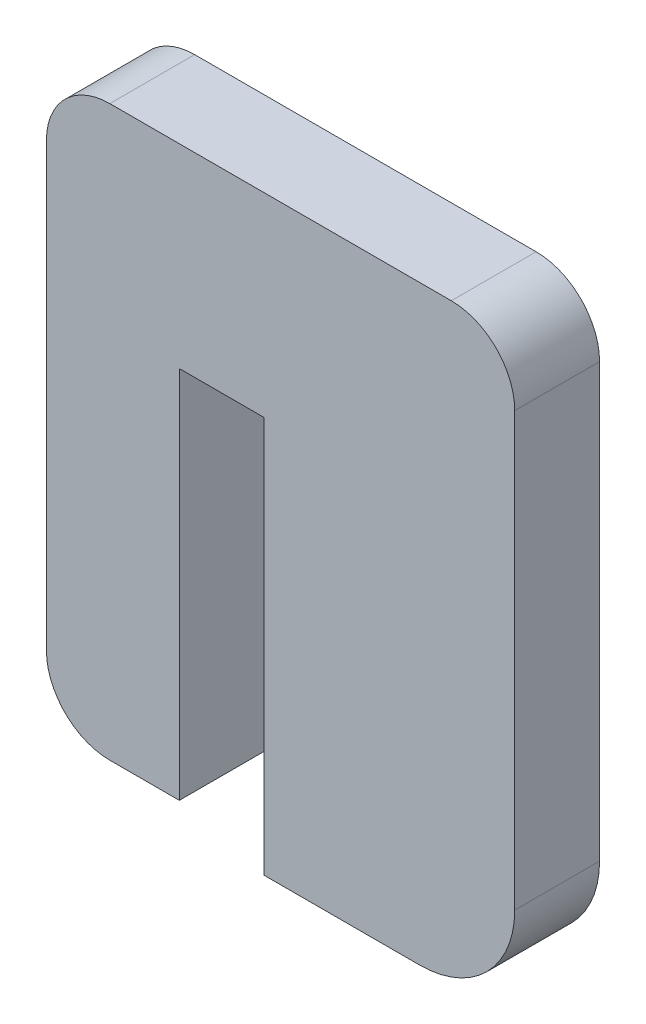
ISO-10303-21;
HEADER;
FILE_DESCRIPTION(('STEP AP214'),'2;1');
FILE_NAME('part.step','',(''),(''),'','','');
FILE_SCHEMA(('AUTOMOTIVE_DESIGN { 1 0 10303 214 1 1 1 1 }'));
ENDSEC;
DATA;
#1=APPLICATION_CONTEXT('core data for automotive mechanical design processes');
#2=APPLICATION_PROTOCOL_DEFINITION('international standard','automotive_design',2000,#1);
#3=PRODUCT_CONTEXT('',#1,'mechanical');
#4=PRODUCT('Part','Part','',(#3));
#5=PRODUCT_RELATED_PRODUCT_CATEGORY('part','',(#4));
#6=PRODUCT_DEFINITION_FORMATION('','',#4);
#7=PRODUCT_DEFINITION_CONTEXT('part definition',#1,'design');
#8=PRODUCT_DEFINITION('design','',#6,#7);
#9=PRODUCT_DEFINITION_SHAPE('','',#8);
#10=(LENGTH_UNIT() NAMED_UNIT(*) SI_UNIT(.MILLI.,.METRE.));
#11=(NAMED_UNIT(*) PLANE_ANGLE_UNIT() SI_UNIT($,.RADIAN.));
#12=(NAMED_UNIT(*) SI_UNIT($,.STERADIAN.) SOLID_ANGLE_UNIT());
#13=UNCERTAINTY_MEASURE_WITH_UNIT(LENGTH_MEASURE(1.E-05),#10,'distance_accuracy_value','');
#14=(GEOMETRIC_REPRESENTATION_CONTEXT(3) GLOBAL_UNCERTAINTY_ASSIGNED_CONTEXT((#13)) GLOBAL_UNIT_ASSIGNED_CONTEXT((#10,
#11,#12)) REPRESENTATION_CONTEXT('',''));
#15=CARTESIAN_POINT('',(0.,0.,0.));
#16=DIRECTION('',(0.,0.,1.));
#17=DIRECTION('',(1.,0.,0.));
#18=AXIS2_PLACEMENT_3D('',#15,#16,#17);
#19=CARTESIAN_POINT('',(4.,5.4181546867,5.35));
#20=DIRECTION('',(0.,0.,-1.));
#21=DIRECTION('',(-1.,0.,0.));
#22=AXIS2_PLACEMENT_3D('',#19,#20,#21);
#23=CYLINDRICAL_SURFACE('',#22,4.);
#24=CARTESIAN_POINT('',(4.,5.4181546867,0.));
#25=DIRECTION('',(0.,0.,1.));
#26=DIRECTION('',(1.,0.,0.));
#27=AXIS2_PLACEMENT_3D('',#24,#25,#26);
#28=CIRCLE('',#27,4.);
#29=CARTESIAN_POINT('',(0.,5.4181548767,0.));
#30=VERTEX_POINT('',#29);
#31=CARTESIAN_POINT('',(4.,1.4181546867,0.));
#32=VERTEX_POINT('',#31);
#33=EDGE_CURVE('E153',#30,#32,#28,.T.);
#34=ORIENTED_EDGE('',*,*,#33,.T.);
#35=DIRECTION('',(0.,0.,-1.));
#36=VECTOR('',#35,1.);
#37=CARTESIAN_POINT('',(4.,1.4181546867,5.35));
#38=LINE('',#37,#36);
#39=CARTESIAN_POINT('',(4.,1.4181546867,5.35));
#40=VERTEX_POINT('',#39);
#41=EDGE_CURVE('E11',#40,#32,#38,.T.);
#42=ORIENTED_EDGE('',*,*,#41,.F.);
#43=CARTESIAN_POINT('',(4.,5.4181546867,5.35));
#44=DIRECTION('',(0.,0.,1.));
#45=DIRECTION('',(1.,0.,0.));
#46=AXIS2_PLACEMENT_3D('',#43,#44,#45);
#47=CIRCLE('',#46,4.);
#48=CARTESIAN_POINT('',(0.,5.4181548767,5.35));
#49=VERTEX_POINT('',#48);
#50=EDGE_CURVE('E175',#49,#40,#47,.T.);
#51=ORIENTED_EDGE('',*,*,#50,.F.);
#52=DIRECTION('',(0.,0.,-1.));
#53=VECTOR('',#52,1.);
#54=CARTESIAN_POINT('',(0.,5.4181548767,5.35));
#55=LINE('',#54,#53);
#56=EDGE_CURVE('E149',#49,#30,#55,.T.);
#57=ORIENTED_EDGE('',*,*,#56,.T.);
#58=EDGE_LOOP('',(#34,#42,#51,#57));
#59=FACE_BOUND('',#58,.T.);
#60=ADVANCED_FACE('F33',(#59),#23,.T.);
#61=CARTESIAN_POINT('',(8.38032457980001,1.4181546867,5.35));
#62=DIRECTION('',(0.,1.,0.));
#63=DIRECTION('',(0.,0.,1.));
#64=AXIS2_PLACEMENT_3D('',#61,#62,#63);
#65=PLANE('',#64);
#66=DIRECTION('',(1.,0.,0.));
#67=VECTOR('',#66,1.);
#68=CARTESIAN_POINT('',(8.38032457980001,1.4181546867,0.));
#69=LINE('',#68,#67);
#70=CARTESIAN_POINT('',(8.38032457980001,1.4181546867,0.));
#71=VERTEX_POINT('',#70);
#72=EDGE_CURVE('E156',#32,#71,#69,.T.);
#73=ORIENTED_EDGE('',*,*,#72,.T.);
#74=DIRECTION('',(0.,0.,-1.));
#75=VECTOR('',#74,1.);
#76=CARTESIAN_POINT('',(8.38032457980001,1.4181546867,5.35));
#77=LINE('',#76,#75);
#78=CARTESIAN_POINT('',(8.38032457980001,1.4181546867,5.35));
#79=VERTEX_POINT('',#78);
#80=EDGE_CURVE('E41',#79,#71,#77,.T.);
#81=ORIENTED_EDGE('',*,*,#80,.F.);
#82=DIRECTION('',(1.,0.,0.));
#83=VECTOR('',#82,1.);
#84=CARTESIAN_POINT('',(8.38032457980001,1.4181546867,5.35));
#85=LINE('',#84,#83);
#86=EDGE_CURVE('E104',#40,#79,#85,.T.);
#87=ORIENTED_EDGE('',*,*,#86,.F.);
#88=ORIENTED_EDGE('',*,*,#41,.T.);
#89=EDGE_LOOP('',(#73,#81,#87,#88));
#90=FACE_BOUND('',#89,.T.);
#91=ADVANCED_FACE('F253',(#90),#65,.F.);
#92=CARTESIAN_POINT('',(8.38032457980001,25.0000003725,5.35));
#93=DIRECTION('',(-1.,0.,0.));
#94=DIRECTION('',(0.,0.,1.));
#95=AXIS2_PLACEMENT_3D('',#92,#93,#94);
#96=PLANE('',#95);
#97=DIRECTION('',(0.,1.,0.));
#98=VECTOR('',#97,1.);
#99=CARTESIAN_POINT('',(8.38032457980001,25.0000003725,0.));
#100=LINE('',#99,#98);
#101=CARTESIAN_POINT('',(8.38032457980001,25.0000003725,0.));
#102=VERTEX_POINT('',#101);
#103=EDGE_CURVE('E158',#71,#102,#100,.T.);
#104=ORIENTED_EDGE('',*,*,#103,.T.);
#105=DIRECTION('',(0.,0.,-1.));
#106=VECTOR('',#105,1.);
#107=CARTESIAN_POINT('',(8.38032457980001,25.0000003725,5.35));
#108=LINE('',#107,#106);
#109=CARTESIAN_POINT('',(8.38032457980001,25.0000003725,5.35));
#110=VERTEX_POINT('',#109);
#111=EDGE_CURVE('E194',#110,#102,#108,.T.);
#112=ORIENTED_EDGE('',*,*,#111,.F.);
#113=DIRECTION('',(0.,1.,0.));
#114=VECTOR('',#113,1.);
#115=CARTESIAN_POINT('',(8.38032457980001,25.0000003725,5.35));
#116=LINE('',#115,#114);
#117=EDGE_CURVE('E202',#79,#110,#116,.T.);
#118=ORIENTED_EDGE('',*,*,#117,.F.);
#119=ORIENTED_EDGE('',*,*,#80,.T.);
#120=EDGE_LOOP('',(#104,#112,#118,#119));
#121=FACE_BOUND('',#120,.T.);
#122=ADVANCED_FACE('F200',(#121),#96,.F.);
#123=CARTESIAN_POINT('',(13.7303248048012,25.0000003725,5.35));
#124=DIRECTION('',(0.,1.,0.));
#125=DIRECTION('',(0.,0.,1.));
#126=AXIS2_PLACEMENT_3D('',#123,#124,#125);
#127=PLANE('',#126);
#128=DIRECTION('',(1.,0.,0.));
#129=VECTOR('',#128,1.);
#130=CARTESIAN_POINT('',(13.7303248048012,25.0000003725,0.));
#131=LINE('',#130,#129);
#132=CARTESIAN_POINT('',(13.7303248048012,25.0000003725,0.));
#133=VERTEX_POINT('',#132);
#134=EDGE_CURVE('E160',#102,#133,#131,.T.);
#135=ORIENTED_EDGE('',*,*,#134,.T.);
#136=DIRECTION('',(0.,0.,-1.));
#137=VECTOR('',#136,1.);
#138=CARTESIAN_POINT('',(13.7303248048012,25.0000003725,5.35));
#139=LINE('',#138,#137);
#140=CARTESIAN_POINT('',(13.7303248048012,25.0000003725,5.35));
#141=VERTEX_POINT('',#140);
#142=EDGE_CURVE('E191',#141,#133,#139,.T.);
#143=ORIENTED_EDGE('',*,*,#142,.F.);
#144=DIRECTION('',(1.,0.,0.));
#145=VECTOR('',#144,1.);
#146=CARTESIAN_POINT('',(13.7303248048012,25.0000003725,5.35));
#147=LINE('',#146,#145);
#148=EDGE_CURVE('E220',#110,#141,#147,.T.);
#149=ORIENTED_EDGE('',*,*,#148,.F.);
#150=ORIENTED_EDGE('',*,*,#111,.T.);
#151=EDGE_LOOP('',(#135,#143,#149,#150));
#152=FACE_BOUND('',#151,.T.);
#153=ADVANCED_FACE('F211',(#152),#127,.F.);
#154=CARTESIAN_POINT('',(13.7303248048012,-1.80411234884143E-13,5.35));
#155=DIRECTION('',(1.,0.,0.));
#156=DIRECTION('',(0.,0.,-1.));
#157=AXIS2_PLACEMENT_3D('',#154,#155,#156);
#158=PLANE('',#157);
#159=DIRECTION('',(0.,-1.,0.));
#160=VECTOR('',#159,1.);
#161=CARTESIAN_POINT('',(13.7303248048012,-1.80411234884143E-13,0.));
#162=LINE('',#161,#160);
#163=CARTESIAN_POINT('',(13.7303248048012,-1.80411234884143E-13,0.));
#164=VERTEX_POINT('',#163);
#165=EDGE_CURVE('E162',#133,#164,#162,.T.);
#166=ORIENTED_EDGE('',*,*,#165,.T.);
#167=DIRECTION('',(0.,0.,-1.));
#168=VECTOR('',#167,1.);
#169=CARTESIAN_POINT('',(13.7303248048012,-1.80411234884143E-13,5.35));
#170=LINE('',#169,#168);
#171=CARTESIAN_POINT('',(13.7303248048012,-1.80411234884143E-13,5.35));
#172=VERTEX_POINT('',#171);
#173=EDGE_CURVE('E188',#172,#164,#170,.T.);
#174=ORIENTED_EDGE('',*,*,#173,.F.);
#175=DIRECTION('',(0.,-1.,0.));
#176=VECTOR('',#175,1.);
#177=CARTESIAN_POINT('',(13.7303248048012,-1.80411234884143E-13,5.35));
#178=LINE('',#177,#176);
#179=EDGE_CURVE('E217',#141,#172,#178,.T.);
#180=ORIENTED_EDGE('',*,*,#179,.F.);
#181=ORIENTED_EDGE('',*,*,#142,.T.);
#182=EDGE_LOOP('',(#166,#174,#180,#181));
#183=FACE_BOUND('',#182,.T.);
#184=ADVANCED_FACE('F215',(#183),#158,.F.);
#185=CARTESIAN_POINT('',(23.5303249210012,-1.80411234884143E-13,5.35));
#186=DIRECTION('',(0.,1.,0.));
#187=DIRECTION('',(0.,0.,1.));
#188=AXIS2_PLACEMENT_3D('',#185,#186,#187);
#189=PLANE('',#188);
#190=DIRECTION('',(1.,0.,0.));
#191=VECTOR('',#190,1.);
#192=CARTESIAN_POINT('',(23.5303249210012,-1.80411234884143E-13,0.));
#193=LINE('',#192,#191);
#194=CARTESIAN_POINT('',(23.5303249210012,-1.80411241501588E-13,0.));
#195=VERTEX_POINT('',#194);
#196=EDGE_CURVE('E164',#164,#195,#193,.T.);
#197=ORIENTED_EDGE('',*,*,#196,.T.);
#198=DIRECTION('',(0.,0.,-1.));
#199=VECTOR('',#198,1.);
#200=CARTESIAN_POINT('',(23.5303249210012,-1.80411241501588E-13,5.35));
#201=LINE('',#200,#199);
#202=CARTESIAN_POINT('',(23.5303249210012,-1.80411241501588E-13,5.35));
#203=VERTEX_POINT('',#202);
#204=EDGE_CURVE('E185',#203,#195,#201,.T.);
#205=ORIENTED_EDGE('',*,*,#204,.F.);
#206=DIRECTION('',(1.,0.,0.));
#207=VECTOR('',#206,1.);
#208=CARTESIAN_POINT('',(23.5303249210012,-1.80411234884143E-13,5.35));
#209=LINE('',#208,#207);
#210=EDGE_CURVE('E219',#172,#203,#209,.T.);
#211=ORIENTED_EDGE('',*,*,#210,.F.);
#212=ORIENTED_EDGE('',*,*,#173,.T.);
#213=EDGE_LOOP('',(#197,#205,#211,#212));
#214=FACE_BOUND('',#213,.T.);
#215=ADVANCED_FACE('F266',(#214),#189,.F.);
#216=CARTESIAN_POINT('',(23.5303240419012,5.99999999999975,5.35));
#217=DIRECTION('',(0.,0.,-1.));
#218=DIRECTION('',(-1.,0.,0.));
#219=AXIS2_PLACEMENT_3D('',#216,#217,#218);
#220=CYLINDRICAL_SURFACE('',#219,6.);
#221=CARTESIAN_POINT('',(23.5303240419012,5.99999999999975,0.));
#222=DIRECTION('',(0.,0.,1.));
#223=DIRECTION('',(1.,0.,0.));
#224=AXIS2_PLACEMENT_3D('',#221,#222,#223);
#225=CIRCLE('',#224,6.);
#226=CARTESIAN_POINT('',(29.5303240419012,5.99999999999975,0.));
#227=VERTEX_POINT('',#226);
#228=EDGE_CURVE('E166',#195,#227,#225,.T.);
#229=ORIENTED_EDGE('',*,*,#228,.T.);
#230=DIRECTION('',(0.,0.,-1.));
#231=VECTOR('',#230,1.);
#232=CARTESIAN_POINT('',(29.5303240419012,5.99999999999975,5.35));
#233=LINE('',#232,#231);
#234=CARTESIAN_POINT('',(29.5303240419012,5.99999999999975,5.35));
#235=VERTEX_POINT('',#234);
#236=EDGE_CURVE('E182',#235,#227,#233,.T.);
#237=ORIENTED_EDGE('',*,*,#236,.F.);
#238=CARTESIAN_POINT('',(23.5303240419012,5.99999999999975,5.35));
#239=DIRECTION('',(0.,0.,1.));
#240=DIRECTION('',(1.,0.,0.));
#241=AXIS2_PLACEMENT_3D('',#238,#239,#240);
#242=CIRCLE('',#241,6.);
#243=EDGE_CURVE('E222',#203,#235,#242,.T.);
#244=ORIENTED_EDGE('',*,*,#243,.F.);
#245=ORIENTED_EDGE('',*,*,#204,.T.);
#246=EDGE_LOOP('',(#229,#237,#244,#245));
#247=FACE_BOUND('',#246,.T.);
#248=ADVANCED_FACE('F269',(#247),#220,.T.);
#249=CARTESIAN_POINT('',(29.5303240419012,33.2781523465998,5.35));
#250=DIRECTION('',(-1.,0.,0.));
#251=DIRECTION('',(0.,0.,1.));
#252=AXIS2_PLACEMENT_3D('',#249,#250,#251);
#253=PLANE('',#252);
#254=DIRECTION('',(0.,1.,0.));
#255=VECTOR('',#254,1.);
#256=CARTESIAN_POINT('',(29.5303240419012,33.2781523465998,0.));
#257=LINE('',#256,#255);
#258=CARTESIAN_POINT('',(29.5303240419012,33.2781523465998,0.));
#259=VERTEX_POINT('',#258);
#260=EDGE_CURVE('E168',#227,#259,#257,.T.);
#261=ORIENTED_EDGE('',*,*,#260,.T.);
#262=DIRECTION('',(0.,0.,-1.));
#263=VECTOR('',#262,1.);
#264=CARTESIAN_POINT('',(29.5303240419012,33.2781523465998,5.35));
#265=LINE('',#264,#263);
#266=CARTESIAN_POINT('',(29.5303240419012,33.2781523465998,5.35));
#267=VERTEX_POINT('',#266);
#268=EDGE_CURVE('E179',#267,#259,#265,.T.);
#269=ORIENTED_EDGE('',*,*,#268,.F.);
#270=DIRECTION('',(0.,1.,0.));
#271=VECTOR('',#270,1.);
#272=CARTESIAN_POINT('',(29.5303240419012,33.2781523465998,5.35));
#273=LINE('',#272,#271);
#274=EDGE_CURVE('E228',#235,#267,#273,.T.);
#275=ORIENTED_EDGE('',*,*,#274,.F.);
#276=ORIENTED_EDGE('',*,*,#236,.T.);
#277=EDGE_LOOP('',(#261,#269,#275,#276));
#278=FACE_BOUND('',#277,.T.);
#279=ADVANCED_FACE('F234',(#278),#253,.F.);
#280=CARTESIAN_POINT('',(25.5303240419024,33.278149277,5.35));
#281=DIRECTION('',(0.,0.,-1.));
#282=DIRECTION('',(-1.,0.,0.));
#283=AXIS2_PLACEMENT_3D('',#280,#281,#282);
#284=CYLINDRICAL_SURFACE('',#283,4.00000000000001);
#285=CARTESIAN_POINT('',(25.5303240419024,33.278149277,0.));
#286=DIRECTION('',(0.,0.,1.));
#287=DIRECTION('',(1.,0.,0.));
#288=AXIS2_PLACEMENT_3D('',#285,#286,#287);
#289=CIRCLE('',#288,4.00000000000001);
#290=CARTESIAN_POINT('',(25.5303240419024,37.278149277,0.));
#291=VERTEX_POINT('',#290);
#292=EDGE_CURVE('E170',#259,#291,#289,.T.);
#293=ORIENTED_EDGE('',*,*,#292,.T.);
#294=DIRECTION('',(0.,0.,-1.));
#295=VECTOR('',#294,1.);
#296=CARTESIAN_POINT('',(25.5303240419024,37.278149277,5.35));
#297=LINE('',#296,#295);
#298=CARTESIAN_POINT('',(25.5303240419024,37.278149277,5.35));
#299=VERTEX_POINT('',#298);
#300=EDGE_CURVE('E144',#299,#291,#297,.T.);
#301=ORIENTED_EDGE('',*,*,#300,.F.);
#302=CARTESIAN_POINT('',(25.5303240419024,33.278149277,5.35));
#303=DIRECTION('',(0.,0.,1.));
#304=DIRECTION('',(1.,0.,0.));
#305=AXIS2_PLACEMENT_3D('',#302,#303,#304);
#306=CIRCLE('',#305,4.00000000000001);
#307=EDGE_CURVE('E135',#267,#299,#306,.T.);
#308=ORIENTED_EDGE('',*,*,#307,.F.);
#309=ORIENTED_EDGE('',*,*,#268,.T.);
#310=EDGE_LOOP('',(#293,#301,#308,#309));
#311=FACE_BOUND('',#310,.T.);
#312=ADVANCED_FACE('F238',(#311),#284,.T.);
#313=CARTESIAN_POINT('',(3.99999972440119,37.278149277,5.35));
#314=DIRECTION('',(0.,-1.,0.));
#315=DIRECTION('',(0.,0.,-1.));
#316=AXIS2_PLACEMENT_3D('',#313,#314,#315);
#317=PLANE('',#316);
#318=DIRECTION('',(-1.,0.,0.));
#319=VECTOR('',#318,1.);
#320=CARTESIAN_POINT('',(3.99999972440119,37.278149277,0.));
#321=LINE('',#320,#319);
#322=CARTESIAN_POINT('',(3.99999972440119,37.278149277,0.));
#323=VERTEX_POINT('',#322);
#324=EDGE_CURVE('E143',#291,#323,#321,.T.);
#325=ORIENTED_EDGE('',*,*,#324,.T.);
#326=DIRECTION('',(0.,0.,-1.));
#327=VECTOR('',#326,1.);
#328=CARTESIAN_POINT('',(3.99999972440119,37.278149277,5.35));
#329=LINE('',#328,#327);
#330=CARTESIAN_POINT('',(3.99999972440119,37.278149277,5.35));
#331=VERTEX_POINT('',#330);
#332=EDGE_CURVE('E140',#331,#323,#329,.T.);
#333=ORIENTED_EDGE('',*,*,#332,.F.);
#334=DIRECTION('',(-1.,0.,0.));
#335=VECTOR('',#334,1.);
#336=CARTESIAN_POINT('',(3.99999972440119,37.278149277,5.35));
#337=LINE('',#336,#335);
#338=EDGE_CURVE('E129',#299,#331,#337,.T.);
#339=ORIENTED_EDGE('',*,*,#338,.F.);
#340=ORIENTED_EDGE('',*,*,#300,.T.);
#341=EDGE_LOOP('',(#325,#333,#339,#340));
#342=FACE_BOUND('',#341,.T.);
#343=ADVANCED_FACE('F141',(#342),#317,.F.);
#344=CARTESIAN_POINT('',(4.00000000000002,33.278149277,5.35));
#345=DIRECTION('',(0.,0.,-1.));
#346=DIRECTION('',(-1.,0.,0.));
#347=AXIS2_PLACEMENT_3D('',#344,#345,#346);
#348=CYLINDRICAL_SURFACE('',#347,4.00000000000001);
#349=CARTESIAN_POINT('',(4.00000000000002,33.278149277,0.));
#350=DIRECTION('',(0.,0.,1.));
#351=DIRECTION('',(1.,0.,0.));
#352=AXIS2_PLACEMENT_3D('',#349,#350,#351);
#353=CIRCLE('',#352,4.00000000000001);
#354=CARTESIAN_POINT('',(0.,33.278149277,0.));
#355=VERTEX_POINT('',#354);
#356=EDGE_CURVE('E90',#323,#355,#353,.T.);
#357=ORIENTED_EDGE('',*,*,#356,.T.);
#358=DIRECTION('',(0.,0.,-1.));
#359=VECTOR('',#358,1.);
#360=CARTESIAN_POINT('',(0.,33.278149277,5.35));
#361=LINE('',#360,#359);
#362=CARTESIAN_POINT('',(0.,33.278149277,5.35));
#363=VERTEX_POINT('',#362);
#364=EDGE_CURVE('E145',#363,#355,#361,.T.);
#365=ORIENTED_EDGE('',*,*,#364,.F.);
#366=CARTESIAN_POINT('',(4.00000000000002,33.278149277,5.35));
#367=DIRECTION('',(0.,0.,1.));
#368=DIRECTION('',(1.,0.,0.));
#369=AXIS2_PLACEMENT_3D('',#366,#367,#368);
#370=CIRCLE('',#369,4.00000000000001);
#371=EDGE_CURVE('E133',#331,#363,#370,.T.);
#372=ORIENTED_EDGE('',*,*,#371,.F.);
#373=ORIENTED_EDGE('',*,*,#332,.T.);
#374=EDGE_LOOP('',(#357,#365,#372,#373));
#375=FACE_BOUND('',#374,.T.);
#376=ADVANCED_FACE('F147',(#375),#348,.T.);
#377=CARTESIAN_POINT('',(0.,5.4181548767,5.35));
#378=DIRECTION('',(1.,0.,0.));
#379=DIRECTION('',(0.,0.,-1.));
#380=AXIS2_PLACEMENT_3D('',#377,#378,#379);
#381=PLANE('',#380);
#382=DIRECTION('',(0.,-1.,0.));
#383=VECTOR('',#382,1.);
#384=CARTESIAN_POINT('',(0.,5.4181548767,0.));
#385=LINE('',#384,#383);
#386=EDGE_CURVE('E96',#355,#30,#385,.T.);
#387=ORIENTED_EDGE('',*,*,#386,.T.);
#388=ORIENTED_EDGE('',*,*,#56,.F.);
#389=DIRECTION('',(0.,-1.,0.));
#390=VECTOR('',#389,1.);
#391=CARTESIAN_POINT('',(0.,5.4181548767,5.35));
#392=LINE('',#391,#390);
#393=EDGE_CURVE('E49',#363,#49,#392,.T.);
#394=ORIENTED_EDGE('',*,*,#393,.F.);
#395=ORIENTED_EDGE('',*,*,#364,.T.);
#396=EDGE_LOOP('',(#387,#388,#394,#395));
#397=FACE_BOUND('',#396,.T.);
#398=ADVANCED_FACE('F242',(#397),#381,.F.);
#399=CARTESIAN_POINT('',(4.,5.4181546867,5.35));
#400=DIRECTION('',(0.,0.,1.));
#401=DIRECTION('',(1.,0.,0.));
#402=AXIS2_PLACEMENT_3D('',#399,#400,#401);
#403=PLANE('',#402);
#404=ORIENTED_EDGE('',*,*,#50,.T.);
#405=ORIENTED_EDGE('',*,*,#86,.T.);
#406=ORIENTED_EDGE('',*,*,#117,.T.);
#407=ORIENTED_EDGE('',*,*,#148,.T.);
#408=ORIENTED_EDGE('',*,*,#179,.T.);
#409=ORIENTED_EDGE('',*,*,#210,.T.);
#410=ORIENTED_EDGE('',*,*,#243,.T.);
#411=ORIENTED_EDGE('',*,*,#274,.T.);
#412=ORIENTED_EDGE('',*,*,#307,.T.);
#413=ORIENTED_EDGE('',*,*,#338,.T.);
#414=ORIENTED_EDGE('',*,*,#371,.T.);
#415=ORIENTED_EDGE('',*,*,#393,.T.);
#416=EDGE_LOOP('',(#404,#405,#406,#407,#408,#409,#410,#411,#412,#413,#414,#415));
#417=FACE_BOUND('',#416,.T.);
#418=ADVANCED_FACE('F131',(#417),#403,.T.);
#419=CARTESIAN_POINT('',(4.,5.4181546867,0.));
#420=DIRECTION('',(0.,0.,1.));
#421=DIRECTION('',(1.,0.,0.));
#422=AXIS2_PLACEMENT_3D('',#419,#420,#421);
#423=PLANE('',#422);
#424=ORIENTED_EDGE('',*,*,#33,.F.);
#425=ORIENTED_EDGE('',*,*,#386,.F.);
#426=ORIENTED_EDGE('',*,*,#356,.F.);
#427=ORIENTED_EDGE('',*,*,#324,.F.);
#428=ORIENTED_EDGE('',*,*,#292,.F.);
#429=ORIENTED_EDGE('',*,*,#260,.F.);
#430=ORIENTED_EDGE('',*,*,#228,.F.);
#431=ORIENTED_EDGE('',*,*,#196,.F.);
#432=ORIENTED_EDGE('',*,*,#165,.F.);
#433=ORIENTED_EDGE('',*,*,#134,.F.);
#434=ORIENTED_EDGE('',*,*,#103,.F.);
#435=ORIENTED_EDGE('',*,*,#72,.F.);
#436=EDGE_LOOP('',(#424,#425,#426,#427,#428,#429,#430,#431,#432,#433,#434,#435));
#437=FACE_BOUND('',#436,.T.);
#438=ADVANCED_FACE('F206',(#437),#423,.F.);
#439=CLOSED_SHELL('',(#60,#91,#122,#153,#184,#215,#248,#279,#312,#343,#376,#398,#418,#438));
#440=MANIFOLD_SOLID_BREP('B2',#439);
#441=ADVANCED_BREP_SHAPE_REPRESENTATION('',(#18,#440),#14);
#442=SHAPE_DEFINITION_REPRESENTATION(#9,#441);
ENDSEC;
END-ISO-10303-21;
